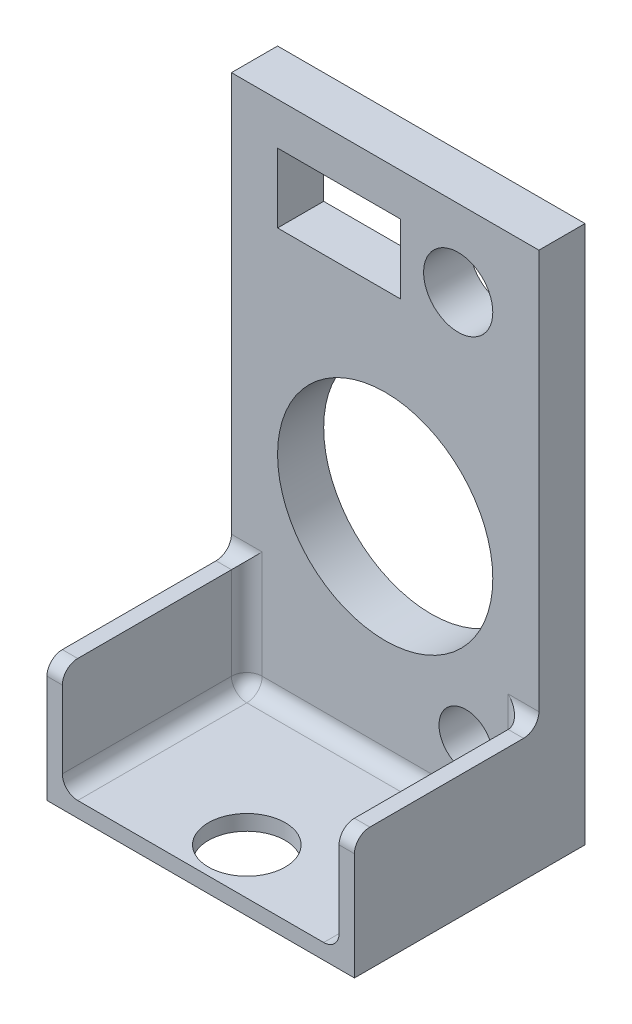
ISO-10303-21;
HEADER;
FILE_DESCRIPTION(('STEP AP214'),'2;1');
FILE_NAME('part.step','',(''),(''),'','','');
FILE_SCHEMA(('AUTOMOTIVE_DESIGN { 1 0 10303 214 1 1 1 1 }'));
ENDSEC;
DATA;
#1=APPLICATION_CONTEXT('core data for automotive mechanical design processes');
#2=APPLICATION_PROTOCOL_DEFINITION('international standard','automotive_design',2000,#1);
#3=PRODUCT_CONTEXT('',#1,'mechanical');
#4=PRODUCT('Part','Part','',(#3));
#5=PRODUCT_RELATED_PRODUCT_CATEGORY('part','',(#4));
#6=PRODUCT_DEFINITION_FORMATION('','',#4);
#7=PRODUCT_DEFINITION_CONTEXT('part definition',#1,'design');
#8=PRODUCT_DEFINITION('design','',#6,#7);
#9=PRODUCT_DEFINITION_SHAPE('','',#8);
#10=(LENGTH_UNIT() NAMED_UNIT(*) SI_UNIT(.MILLI.,.METRE.));
#11=(NAMED_UNIT(*) PLANE_ANGLE_UNIT() SI_UNIT($,.RADIAN.));
#12=(NAMED_UNIT(*) SI_UNIT($,.STERADIAN.) SOLID_ANGLE_UNIT());
#13=UNCERTAINTY_MEASURE_WITH_UNIT(LENGTH_MEASURE(1.E-05),#10,'distance_accuracy_value','');
#14=(GEOMETRIC_REPRESENTATION_CONTEXT(3) GLOBAL_UNCERTAINTY_ASSIGNED_CONTEXT((#13)) GLOBAL_UNIT_ASSIGNED_CONTEXT((#10,
#11,#12)) REPRESENTATION_CONTEXT('',''));
#15=CARTESIAN_POINT('',(0.,0.,0.));
#16=DIRECTION('',(0.,0.,1.));
#17=DIRECTION('',(1.,0.,0.));
#18=AXIS2_PLACEMENT_3D('',#15,#16,#17);
#19=CARTESIAN_POINT('',(0.,0.,0.));
#20=DIRECTION('',(0.,0.,1.));
#21=DIRECTION('',(1.,0.,0.));
#22=AXIS2_PLACEMENT_3D('',#19,#20,#21);
#23=PLANE('',#22);
#24=DIRECTION('',(1.,0.,0.));
#25=VECTOR('',#24,1.);
#26=CARTESIAN_POINT('',(0.,52.25,0.));
#27=LINE('',#26,#25);
#28=CARTESIAN_POINT('',(3.,52.25,0.));
#29=VERTEX_POINT('',#28);
#30=CARTESIAN_POINT('',(11.,52.25,0.));
#31=VERTEX_POINT('',#30);
#32=EDGE_CURVE('E273',#29,#31,#27,.T.);
#33=ORIENTED_EDGE('',*,*,#32,.T.);
#34=DIRECTION('',(0.,-1.,0.));
#35=VECTOR('',#34,1.);
#36=CARTESIAN_POINT('',(11.,0.,0.));
#37=LINE('',#36,#35);
#38=CARTESIAN_POINT('',(11.,47.75,0.));
#39=VERTEX_POINT('',#38);
#40=EDGE_CURVE('E276',#31,#39,#37,.T.);
#41=ORIENTED_EDGE('',*,*,#40,.T.);
#42=DIRECTION('',(1.,0.,0.));
#43=VECTOR('',#42,1.);
#44=CARTESIAN_POINT('',(0.,47.75,0.));
#45=LINE('',#44,#43);
#46=CARTESIAN_POINT('',(3.,47.75,0.));
#47=VERTEX_POINT('',#46);
#48=EDGE_CURVE('E279',#47,#39,#45,.T.);
#49=ORIENTED_EDGE('',*,*,#48,.F.);
#50=DIRECTION('',(0.,-1.,0.));
#51=VECTOR('',#50,1.);
#52=CARTESIAN_POINT('',(3.,0.,0.));
#53=LINE('',#52,#51);
#54=EDGE_CURVE('E223',#29,#47,#53,.T.);
#55=ORIENTED_EDGE('',*,*,#54,.F.);
#56=EDGE_LOOP('',(#33,#41,#49,#55));
#57=FACE_BOUND('',#56,.T.);
#58=CARTESIAN_POINT('',(15.25,25.,0.));
#59=DIRECTION('',(0.,0.,1.));
#60=DIRECTION('',(1.,0.,0.));
#61=AXIS2_PLACEMENT_3D('',#58,#59,#60);
#62=CIRCLE('',#61,1.75);
#63=CARTESIAN_POINT('',(17.,25.,0.));
#64=VERTEX_POINT('',#63);
#65=EDGE_CURVE('E270',#64,#64,#62,.T.);
#66=ORIENTED_EDGE('',*,*,#65,.F.);
#67=EDGE_LOOP('',(#66));
#68=FACE_BOUND('',#67,.T.);
#69=CARTESIAN_POINT('',(14.75,50.,0.));
#70=DIRECTION('',(0.,0.,1.));
#71=DIRECTION('',(1.,0.,0.));
#72=AXIS2_PLACEMENT_3D('',#69,#70,#71);
#73=CIRCLE('',#72,2.25);
#74=CARTESIAN_POINT('',(17.,50.,0.));
#75=VERTEX_POINT('',#74);
#76=EDGE_CURVE('E267',#75,#75,#73,.T.);
#77=ORIENTED_EDGE('',*,*,#76,.F.);
#78=EDGE_LOOP('',(#77));
#79=FACE_BOUND('',#78,.T.);
#80=CARTESIAN_POINT('',(9.99999999999999,35.,0.));
#81=DIRECTION('',(0.,0.,1.));
#82=DIRECTION('',(1.,0.,0.));
#83=AXIS2_PLACEMENT_3D('',#80,#81,#82);
#84=CIRCLE('',#83,7.00000000000001);
#85=CARTESIAN_POINT('',(17.,35.,0.));
#86=VERTEX_POINT('',#85);
#87=EDGE_CURVE('E260',#86,#86,#84,.T.);
#88=ORIENTED_EDGE('',*,*,#87,.F.);
#89=EDGE_LOOP('',(#88));
#90=FACE_BOUND('',#89,.T.);
#91=DIRECTION('',(0.,-1.,0.));
#92=VECTOR('',#91,1.);
#93=CARTESIAN_POINT('',(18.,0.,0.));
#94=LINE('',#93,#92);
#95=CARTESIAN_POINT('',(18.,22.,0.));
#96=VERTEX_POINT('',#95);
#97=CARTESIAN_POINT('',(18.,29.,0.));
#98=VERTEX_POINT('',#97);
#99=EDGE_CURVE('E310',#96,#98,#94,.F.);
#100=ORIENTED_EDGE('',*,*,#99,.T.);
#101=DIRECTION('',(1.,0.,0.));
#102=VECTOR('',#101,1.);
#103=CARTESIAN_POINT('',(20.,29.,0.));
#104=LINE('',#103,#102);
#105=CARTESIAN_POINT('',(20.,29.,0.));
#106=VERTEX_POINT('',#105);
#107=EDGE_CURVE('E308',#98,#106,#104,.T.);
#108=ORIENTED_EDGE('',*,*,#107,.T.);
#109=DIRECTION('',(0.,-1.,0.));
#110=VECTOR('',#109,1.);
#111=CARTESIAN_POINT('',(20.,0.,0.));
#112=LINE('',#111,#110);
#113=CARTESIAN_POINT('',(20.,55.,0.));
#114=VERTEX_POINT('',#113);
#115=EDGE_CURVE('E219',#114,#106,#112,.T.);
#116=ORIENTED_EDGE('',*,*,#115,.F.);
#117=DIRECTION('',(1.,0.,0.));
#118=VECTOR('',#117,1.);
#119=CARTESIAN_POINT('',(0.,55.,0.));
#120=LINE('',#119,#118);
#121=CARTESIAN_POINT('',(0.,55.,0.));
#122=VERTEX_POINT('',#121);
#123=EDGE_CURVE('E250',#122,#114,#120,.T.);
#124=ORIENTED_EDGE('',*,*,#123,.F.);
#125=DIRECTION('',(0.,-1.,0.));
#126=VECTOR('',#125,1.);
#127=CARTESIAN_POINT('',(0.,0.,0.));
#128=LINE('',#127,#126);
#129=CARTESIAN_POINT('',(0.,29.,0.));
#130=VERTEX_POINT('',#129);
#131=EDGE_CURVE('E257',#122,#130,#128,.T.);
#132=ORIENTED_EDGE('',*,*,#131,.T.);
#133=DIRECTION('',(1.,0.,0.));
#134=VECTOR('',#133,1.);
#135=CARTESIAN_POINT('',(1.,29.,0.));
#136=LINE('',#135,#134);
#137=CARTESIAN_POINT('',(2.,29.,0.));
#138=VERTEX_POINT('',#137);
#139=EDGE_CURVE('E315',#130,#138,#136,.T.);
#140=ORIENTED_EDGE('',*,*,#139,.T.);
#141=DIRECTION('',(0.,-1.,0.));
#142=VECTOR('',#141,1.);
#143=CARTESIAN_POINT('',(2.,21.,0.));
#144=LINE('',#143,#142);
#145=CARTESIAN_POINT('',(2.,22.,0.));
#146=VERTEX_POINT('',#145);
#147=EDGE_CURVE('E320',#138,#146,#144,.T.);
#148=ORIENTED_EDGE('',*,*,#147,.T.);
#149=DIRECTION('',(1.,0.,0.));
#150=VECTOR('',#149,1.);
#151=CARTESIAN_POINT('',(19.,22.,0.));
#152=LINE('',#151,#150);
#153=EDGE_CURVE('E286',#146,#96,#152,.T.);
#154=ORIENTED_EDGE('',*,*,#153,.T.);
#155=EDGE_LOOP('',(#100,#108,#116,#124,#132,#140,#148,#154));
#156=FACE_BOUND('',#155,.T.);
#157=ADVANCED_FACE('F35',(#57,#68,#79,#90,#156),#23,.T.);
#158=CARTESIAN_POINT('',(0.,52.25,-3.));
#159=DIRECTION('',(0.,-1.,0.));
#160=DIRECTION('',(0.,0.,-1.));
#161=AXIS2_PLACEMENT_3D('',#158,#159,#160);
#162=PLANE('',#161);
#163=ORIENTED_EDGE('',*,*,#32,.F.);
#164=DIRECTION('',(0.,0.,1.));
#165=VECTOR('',#164,1.);
#166=CARTESIAN_POINT('',(3.,52.25,-3.));
#167=LINE('',#166,#165);
#168=CARTESIAN_POINT('',(3.,52.25,-3.));
#169=VERTEX_POINT('',#168);
#170=EDGE_CURVE('E284',#169,#29,#167,.T.);
#171=ORIENTED_EDGE('',*,*,#170,.F.);
#172=DIRECTION('',(1.,0.,0.));
#173=VECTOR('',#172,1.);
#174=CARTESIAN_POINT('',(0.,52.25,-3.));
#175=LINE('',#174,#173);
#176=CARTESIAN_POINT('',(11.,52.25,-3.));
#177=VERTEX_POINT('',#176);
#178=EDGE_CURVE('E237',#169,#177,#175,.T.);
#179=ORIENTED_EDGE('',*,*,#178,.T.);
#180=DIRECTION('',(0.,0.,1.));
#181=VECTOR('',#180,1.);
#182=CARTESIAN_POINT('',(11.,52.25,-3.));
#183=LINE('',#182,#181);
#184=EDGE_CURVE('E199',#177,#31,#183,.T.);
#185=ORIENTED_EDGE('',*,*,#184,.T.);
#186=EDGE_LOOP('',(#163,#171,#179,#185));
#187=FACE_BOUND('',#186,.T.);
#188=ADVANCED_FACE('F456',(#187),#162,.T.);
#189=CARTESIAN_POINT('',(3.,0.,-3.));
#190=DIRECTION('',(-1.,0.,0.));
#191=DIRECTION('',(0.,-1.,0.));
#192=AXIS2_PLACEMENT_3D('',#189,#190,#191);
#193=PLANE('',#192);
#194=ORIENTED_EDGE('',*,*,#54,.T.);
#195=DIRECTION('',(0.,0.,1.));
#196=VECTOR('',#195,1.);
#197=CARTESIAN_POINT('',(3.,47.75,-3.));
#198=LINE('',#197,#196);
#199=CARTESIAN_POINT('',(3.,47.75,-3.));
#200=VERTEX_POINT('',#199);
#201=EDGE_CURVE('E287',#200,#47,#198,.T.);
#202=ORIENTED_EDGE('',*,*,#201,.F.);
#203=DIRECTION('',(0.,-1.,0.));
#204=VECTOR('',#203,1.);
#205=CARTESIAN_POINT('',(3.,0.,-3.));
#206=LINE('',#205,#204);
#207=EDGE_CURVE('E245',#169,#200,#206,.T.);
#208=ORIENTED_EDGE('',*,*,#207,.F.);
#209=ORIENTED_EDGE('',*,*,#170,.T.);
#210=EDGE_LOOP('',(#194,#202,#208,#209));
#211=FACE_BOUND('',#210,.T.);
#212=ADVANCED_FACE('F462',(#211),#193,.F.);
#213=CARTESIAN_POINT('',(0.,47.75,-3.));
#214=DIRECTION('',(0.,-1.,0.));
#215=DIRECTION('',(0.,0.,-1.));
#216=AXIS2_PLACEMENT_3D('',#213,#214,#215);
#217=PLANE('',#216);
#218=ORIENTED_EDGE('',*,*,#48,.T.);
#219=DIRECTION('',(0.,0.,1.));
#220=VECTOR('',#219,1.);
#221=CARTESIAN_POINT('',(11.,47.75,-3.));
#222=LINE('',#221,#220);
#223=CARTESIAN_POINT('',(11.,47.75,-3.));
#224=VERTEX_POINT('',#223);
#225=EDGE_CURVE('E290',#224,#39,#222,.T.);
#226=ORIENTED_EDGE('',*,*,#225,.F.);
#227=DIRECTION('',(1.,0.,0.));
#228=VECTOR('',#227,1.);
#229=CARTESIAN_POINT('',(0.,47.75,-3.));
#230=LINE('',#229,#228);
#231=EDGE_CURVE('E243',#200,#224,#230,.T.);
#232=ORIENTED_EDGE('',*,*,#231,.F.);
#233=ORIENTED_EDGE('',*,*,#201,.T.);
#234=EDGE_LOOP('',(#218,#226,#232,#233));
#235=FACE_BOUND('',#234,.T.);
#236=ADVANCED_FACE('F472',(#235),#217,.F.);
#237=CARTESIAN_POINT('',(0.,20.,-3.));
#238=DIRECTION('',(0.,-1.,0.));
#239=DIRECTION('',(1.,0.,0.));
#240=AXIS2_PLACEMENT_3D('',#237,#238,#239);
#241=PLANE('',#240);
#242=CARTESIAN_POINT('',(10.,20.,9.));
#243=DIRECTION('',(0.,-1.,0.));
#244=DIRECTION('',(1.,0.,0.));
#245=AXIS2_PLACEMENT_3D('',#242,#243,#244);
#246=CIRCLE('',#245,2.5);
#247=CARTESIAN_POINT('',(12.5,20.,9.));
#248=VERTEX_POINT('',#247);
#249=EDGE_CURVE('E337',#248,#248,#246,.T.);
#250=ORIENTED_EDGE('',*,*,#249,.F.);
#251=EDGE_LOOP('',(#250));
#252=FACE_BOUND('',#251,.T.);
#253=DIRECTION('',(0.,0.,1.));
#254=VECTOR('',#253,1.);
#255=CARTESIAN_POINT('',(20.,20.,-3.));
#256=LINE('',#255,#254);
#257=CARTESIAN_POINT('',(20.,20.,-3.));
#258=VERTEX_POINT('',#257);
#259=CARTESIAN_POINT('',(20.,20.,12.));
#260=VERTEX_POINT('',#259);
#261=EDGE_CURVE('E205',#258,#260,#256,.T.);
#262=ORIENTED_EDGE('',*,*,#261,.T.);
#263=DIRECTION('',(1.,0.,0.));
#264=VECTOR('',#263,1.);
#265=CARTESIAN_POINT('',(0.,20.,12.));
#266=LINE('',#265,#264);
#267=CARTESIAN_POINT('',(0.,20.,12.));
#268=VERTEX_POINT('',#267);
#269=EDGE_CURVE('E183',#268,#260,#266,.T.);
#270=ORIENTED_EDGE('',*,*,#269,.F.);
#271=DIRECTION('',(0.,0.,1.));
#272=VECTOR('',#271,1.);
#273=CARTESIAN_POINT('',(0.,20.,-3.));
#274=LINE('',#273,#272);
#275=CARTESIAN_POINT('',(0.,20.,-3.));
#276=VERTEX_POINT('',#275);
#277=EDGE_CURVE('E192',#276,#268,#274,.T.);
#278=ORIENTED_EDGE('',*,*,#277,.F.);
#279=DIRECTION('',(1.,0.,0.));
#280=VECTOR('',#279,1.);
#281=CARTESIAN_POINT('',(0.,20.,-3.));
#282=LINE('',#281,#280);
#283=EDGE_CURVE('E220',#276,#258,#282,.T.);
#284=ORIENTED_EDGE('',*,*,#283,.T.);
#285=EDGE_LOOP('',(#262,#270,#278,#284));
#286=FACE_BOUND('',#285,.T.);
#287=ADVANCED_FACE('F203',(#252,#286),#241,.T.);
#288=CARTESIAN_POINT('',(0.,0.,-3.));
#289=DIRECTION('',(-1.,0.,0.));
#290=DIRECTION('',(0.,-1.,0.));
#291=AXIS2_PLACEMENT_3D('',#288,#289,#290);
#292=PLANE('',#291);
#293=DIRECTION('',(0.,-1.,0.));
#294=VECTOR('',#293,1.);
#295=CARTESIAN_POINT('',(0.,0.,12.));
#296=LINE('',#295,#294);
#297=CARTESIAN_POINT('',(0.,27.,12.));
#298=VERTEX_POINT('',#297);
#299=EDGE_CURVE('E178',#298,#268,#296,.T.);
#300=ORIENTED_EDGE('',*,*,#299,.F.);
#301=CARTESIAN_POINT('',(0.,27.,11.));
#302=DIRECTION('',(-1.,0.,0.));
#303=DIRECTION('',(0.,-1.,0.));
#304=AXIS2_PLACEMENT_3D('',#301,#302,#303);
#305=CIRCLE('',#304,1.);
#306=CARTESIAN_POINT('',(0.,28.,11.));
#307=VERTEX_POINT('',#306);
#308=EDGE_CURVE('E410',#298,#307,#305,.T.);
#309=ORIENTED_EDGE('',*,*,#308,.T.);
#310=DIRECTION('',(0.,0.,-1.));
#311=VECTOR('',#310,1.);
#312=CARTESIAN_POINT('',(0.,28.,12.));
#313=LINE('',#312,#311);
#314=CARTESIAN_POINT('',(0.,28.,1.));
#315=VERTEX_POINT('',#314);
#316=EDGE_CURVE('E216',#307,#315,#313,.T.);
#317=ORIENTED_EDGE('',*,*,#316,.T.);
#318=CARTESIAN_POINT('',(0.,29.,1.));
#319=DIRECTION('',(-1.,0.,0.));
#320=DIRECTION('',(0.,-1.,0.));
#321=AXIS2_PLACEMENT_3D('',#318,#319,#320);
#322=CIRCLE('',#321,1.);
#323=EDGE_CURVE('E418',#315,#130,#322,.F.);
#324=ORIENTED_EDGE('',*,*,#323,.T.);
#325=ORIENTED_EDGE('',*,*,#131,.F.);
#326=DIRECTION('',(0.,0.,1.));
#327=VECTOR('',#326,1.);
#328=CARTESIAN_POINT('',(0.,55.,-3.));
#329=LINE('',#328,#327);
#330=CARTESIAN_POINT('',(0.,55.,-3.));
#331=VERTEX_POINT('',#330);
#332=EDGE_CURVE('E200',#331,#122,#329,.T.);
#333=ORIENTED_EDGE('',*,*,#332,.F.);
#334=DIRECTION('',(0.,-1.,0.));
#335=VECTOR('',#334,1.);
#336=CARTESIAN_POINT('',(0.,0.,-3.));
#337=LINE('',#336,#335);
#338=EDGE_CURVE('E195',#331,#276,#337,.T.);
#339=ORIENTED_EDGE('',*,*,#338,.T.);
#340=ORIENTED_EDGE('',*,*,#277,.T.);
#341=EDGE_LOOP('',(#300,#309,#317,#324,#325,#333,#339,#340));
#342=FACE_BOUND('',#341,.T.);
#343=ADVANCED_FACE('F193',(#342),#292,.T.);
#344=CARTESIAN_POINT('',(0.,55.,-3.));
#345=DIRECTION('',(0.,-1.,0.));
#346=DIRECTION('',(0.,0.,-1.));
#347=AXIS2_PLACEMENT_3D('',#344,#345,#346);
#348=PLANE('',#347);
#349=ORIENTED_EDGE('',*,*,#123,.T.);
#350=DIRECTION('',(0.,0.,1.));
#351=VECTOR('',#350,1.);
#352=CARTESIAN_POINT('',(20.,55.,-3.));
#353=LINE('',#352,#351);
#354=CARTESIAN_POINT('',(20.,55.,-3.));
#355=VERTEX_POINT('',#354);
#356=EDGE_CURVE('E293',#355,#114,#353,.T.);
#357=ORIENTED_EDGE('',*,*,#356,.F.);
#358=DIRECTION('',(1.,0.,0.));
#359=VECTOR('',#358,1.);
#360=CARTESIAN_POINT('',(0.,55.,-3.));
#361=LINE('',#360,#359);
#362=EDGE_CURVE('E225',#331,#355,#361,.T.);
#363=ORIENTED_EDGE('',*,*,#362,.F.);
#364=ORIENTED_EDGE('',*,*,#332,.T.);
#365=EDGE_LOOP('',(#349,#357,#363,#364));
#366=FACE_BOUND('',#365,.T.);
#367=ADVANCED_FACE('F485',(#366),#348,.F.);
#368=CARTESIAN_POINT('',(15.25,25.,-3.));
#369=DIRECTION('',(0.,0.,1.));
#370=DIRECTION('',(1.,0.,0.));
#371=AXIS2_PLACEMENT_3D('',#368,#369,#370);
#372=CYLINDRICAL_SURFACE('',#371,1.75);
#373=CARTESIAN_POINT('',(15.25,25.,-3.));
#374=DIRECTION('',(0.,0.,1.));
#375=DIRECTION('',(1.,0.,0.));
#376=AXIS2_PLACEMENT_3D('',#373,#374,#375);
#377=CIRCLE('',#376,1.75);
#378=CARTESIAN_POINT('',(17.,25.,-3.));
#379=VERTEX_POINT('',#378);
#380=EDGE_CURVE('E234',#379,#379,#377,.T.);
#381=ORIENTED_EDGE('',*,*,#380,.F.);
#382=EDGE_LOOP('',(#381));
#383=FACE_BOUND('',#382,.T.);
#384=ORIENTED_EDGE('',*,*,#65,.T.);
#385=EDGE_LOOP('',(#384));
#386=FACE_BOUND('',#385,.T.);
#387=ADVANCED_FACE('F481',(#383,#386),#372,.F.);
#388=CARTESIAN_POINT('',(14.75,50.,-3.));
#389=DIRECTION('',(0.,0.,1.));
#390=DIRECTION('',(1.,0.,0.));
#391=AXIS2_PLACEMENT_3D('',#388,#389,#390);
#392=CYLINDRICAL_SURFACE('',#391,2.25);
#393=CARTESIAN_POINT('',(14.75,50.,-3.));
#394=DIRECTION('',(0.,0.,1.));
#395=DIRECTION('',(1.,0.,0.));
#396=AXIS2_PLACEMENT_3D('',#393,#394,#395);
#397=CIRCLE('',#396,2.25);
#398=CARTESIAN_POINT('',(17.,50.,-3.));
#399=VERTEX_POINT('',#398);
#400=EDGE_CURVE('E231',#399,#399,#397,.T.);
#401=ORIENTED_EDGE('',*,*,#400,.F.);
#402=EDGE_LOOP('',(#401));
#403=FACE_BOUND('',#402,.T.);
#404=ORIENTED_EDGE('',*,*,#76,.T.);
#405=EDGE_LOOP('',(#404));
#406=FACE_BOUND('',#405,.T.);
#407=ADVANCED_FACE('F484',(#403,#406),#392,.F.);
#408=CARTESIAN_POINT('',(9.99999999999999,35.,-3.));
#409=DIRECTION('',(0.,0.,1.));
#410=DIRECTION('',(1.,0.,0.));
#411=AXIS2_PLACEMENT_3D('',#408,#409,#410);
#412=CYLINDRICAL_SURFACE('',#411,7.00000000000001);
#413=CARTESIAN_POINT('',(9.99999999999999,35.,-3.));
#414=DIRECTION('',(0.,0.,1.));
#415=DIRECTION('',(1.,0.,0.));
#416=AXIS2_PLACEMENT_3D('',#413,#414,#415);
#417=CIRCLE('',#416,7.00000000000001);
#418=CARTESIAN_POINT('',(17.,35.,-3.));
#419=VERTEX_POINT('',#418);
#420=EDGE_CURVE('E228',#419,#419,#417,.T.);
#421=ORIENTED_EDGE('',*,*,#420,.F.);
#422=EDGE_LOOP('',(#421));
#423=FACE_BOUND('',#422,.T.);
#424=ORIENTED_EDGE('',*,*,#87,.T.);
#425=EDGE_LOOP('',(#424));
#426=FACE_BOUND('',#425,.T.);
#427=ADVANCED_FACE('F489',(#423,#426),#412,.F.);
#428=CARTESIAN_POINT('',(20.,0.,-3.));
#429=DIRECTION('',(-1.,0.,0.));
#430=DIRECTION('',(0.,-1.,0.));
#431=AXIS2_PLACEMENT_3D('',#428,#429,#430);
#432=PLANE('',#431);
#433=DIRECTION('',(0.,0.,-1.));
#434=VECTOR('',#433,1.);
#435=CARTESIAN_POINT('',(20.,28.,12.));
#436=LINE('',#435,#434);
#437=CARTESIAN_POINT('',(20.,28.,11.));
#438=VERTEX_POINT('',#437);
#439=CARTESIAN_POINT('',(20.,28.,1.));
#440=VERTEX_POINT('',#439);
#441=EDGE_CURVE('E208',#438,#440,#436,.T.);
#442=ORIENTED_EDGE('',*,*,#441,.F.);
#443=CARTESIAN_POINT('',(20.,27.,11.));
#444=DIRECTION('',(-1.,0.,0.));
#445=DIRECTION('',(0.,-1.,0.));
#446=AXIS2_PLACEMENT_3D('',#443,#444,#445);
#447=CIRCLE('',#446,1.);
#448=CARTESIAN_POINT('',(20.,27.,12.));
#449=VERTEX_POINT('',#448);
#450=EDGE_CURVE('E433',#438,#449,#447,.F.);
#451=ORIENTED_EDGE('',*,*,#450,.T.);
#452=DIRECTION('',(0.,-1.,0.));
#453=VECTOR('',#452,1.);
#454=CARTESIAN_POINT('',(20.,0.,12.));
#455=LINE('',#454,#453);
#456=EDGE_CURVE('E206',#449,#260,#455,.T.);
#457=ORIENTED_EDGE('',*,*,#456,.T.);
#458=ORIENTED_EDGE('',*,*,#261,.F.);
#459=DIRECTION('',(0.,-1.,0.));
#460=VECTOR('',#459,1.);
#461=CARTESIAN_POINT('',(20.,0.,-3.));
#462=LINE('',#461,#460);
#463=EDGE_CURVE('E222',#355,#258,#462,.T.);
#464=ORIENTED_EDGE('',*,*,#463,.F.);
#465=ORIENTED_EDGE('',*,*,#356,.T.);
#466=ORIENTED_EDGE('',*,*,#115,.T.);
#467=CARTESIAN_POINT('',(20.,29.,1.));
#468=DIRECTION('',(-1.,0.,0.));
#469=DIRECTION('',(0.,-1.,0.));
#470=AXIS2_PLACEMENT_3D('',#467,#468,#469);
#471=CIRCLE('',#470,1.);
#472=EDGE_CURVE('E416',#106,#440,#471,.T.);
#473=ORIENTED_EDGE('',*,*,#472,.T.);
#474=EDGE_LOOP('',(#442,#451,#457,#458,#464,#465,#466,#473));
#475=FACE_BOUND('',#474,.T.);
#476=ADVANCED_FACE('F300',(#475),#432,.F.);
#477=CARTESIAN_POINT('',(11.,0.,-3.));
#478=DIRECTION('',(-1.,0.,0.));
#479=DIRECTION('',(0.,-1.,0.));
#480=AXIS2_PLACEMENT_3D('',#477,#478,#479);
#481=PLANE('',#480);
#482=ORIENTED_EDGE('',*,*,#40,.F.);
#483=ORIENTED_EDGE('',*,*,#184,.F.);
#484=DIRECTION('',(0.,-1.,0.));
#485=VECTOR('',#484,1.);
#486=CARTESIAN_POINT('',(11.,0.,-3.));
#487=LINE('',#486,#485);
#488=EDGE_CURVE('E240',#177,#224,#487,.T.);
#489=ORIENTED_EDGE('',*,*,#488,.T.);
#490=ORIENTED_EDGE('',*,*,#225,.T.);
#491=EDGE_LOOP('',(#482,#483,#489,#490));
#492=FACE_BOUND('',#491,.T.);
#493=ADVANCED_FACE('F477',(#492),#481,.T.);
#494=CARTESIAN_POINT('',(0.,0.,-3.));
#495=DIRECTION('',(0.,0.,1.));
#496=DIRECTION('',(1.,0.,0.));
#497=AXIS2_PLACEMENT_3D('',#494,#495,#496);
#498=PLANE('',#497);
#499=ORIENTED_EDGE('',*,*,#283,.F.);
#500=ORIENTED_EDGE('',*,*,#338,.F.);
#501=ORIENTED_EDGE('',*,*,#362,.T.);
#502=ORIENTED_EDGE('',*,*,#463,.T.);
#503=EDGE_LOOP('',(#499,#500,#501,#502));
#504=FACE_BOUND('',#503,.T.);
#505=ORIENTED_EDGE('',*,*,#420,.T.);
#506=EDGE_LOOP('',(#505));
#507=FACE_BOUND('',#506,.T.);
#508=ORIENTED_EDGE('',*,*,#400,.T.);
#509=EDGE_LOOP('',(#508));
#510=FACE_BOUND('',#509,.T.);
#511=ORIENTED_EDGE('',*,*,#380,.T.);
#512=EDGE_LOOP('',(#511));
#513=FACE_BOUND('',#512,.T.);
#514=ORIENTED_EDGE('',*,*,#178,.F.);
#515=ORIENTED_EDGE('',*,*,#207,.T.);
#516=ORIENTED_EDGE('',*,*,#231,.T.);
#517=ORIENTED_EDGE('',*,*,#488,.F.);
#518=EDGE_LOOP('',(#514,#515,#516,#517));
#519=FACE_BOUND('',#518,.T.);
#520=ADVANCED_FACE('F468',(#504,#507,#510,#513,#519),#498,.F.);
#521=CARTESIAN_POINT('',(0.,27.9999999999999,12.));
#522=DIRECTION('',(0.,1.,0.));
#523=DIRECTION('',(-1.,0.,0.));
#524=AXIS2_PLACEMENT_3D('',#521,#522,#523);
#525=PLANE('',#524);
#526=ORIENTED_EDGE('',*,*,#441,.T.);
#527=DIRECTION('',(1.,0.,0.));
#528=VECTOR('',#527,1.);
#529=CARTESIAN_POINT('',(19.,28.,1.));
#530=LINE('',#529,#528);
#531=CARTESIAN_POINT('',(19.,28.,1.));
#532=VERTEX_POINT('',#531);
#533=EDGE_CURVE('E318',#440,#532,#530,.F.);
#534=ORIENTED_EDGE('',*,*,#533,.T.);
#535=DIRECTION('',(0.,0.,-1.));
#536=VECTOR('',#535,1.);
#537=CARTESIAN_POINT('',(19.,28.,12.));
#538=LINE('',#537,#536);
#539=CARTESIAN_POINT('',(19.,28.,11.));
#540=VERTEX_POINT('',#539);
#541=EDGE_CURVE('E215',#540,#532,#538,.T.);
#542=ORIENTED_EDGE('',*,*,#541,.F.);
#543=DIRECTION('',(1.,0.,0.));
#544=VECTOR('',#543,1.);
#545=CARTESIAN_POINT('',(0.,27.9999999999999,11.));
#546=LINE('',#545,#544);
#547=EDGE_CURVE('E314',#540,#438,#546,.T.);
#548=ORIENTED_EDGE('',*,*,#547,.T.);
#549=EDGE_LOOP('',(#526,#534,#542,#548));
#550=FACE_BOUND('',#549,.T.);
#551=ADVANCED_FACE('F635',(#550),#525,.T.);
#552=CARTESIAN_POINT('',(19.,0.,12.));
#553=DIRECTION('',(1.,0.,0.));
#554=DIRECTION('',(0.,0.,-1.));
#555=AXIS2_PLACEMENT_3D('',#552,#553,#554);
#556=PLANE('',#555);
#557=DIRECTION('',(0.,-1.,0.));
#558=VECTOR('',#557,1.);
#559=CARTESIAN_POINT('',(19.,0.,12.));
#560=LINE('',#559,#558);
#561=CARTESIAN_POINT('',(19.,27.,12.));
#562=VERTEX_POINT('',#561);
#563=CARTESIAN_POINT('',(19.,22.,12.));
#564=VERTEX_POINT('',#563);
#565=EDGE_CURVE('E336',#562,#564,#560,.T.);
#566=ORIENTED_EDGE('',*,*,#565,.F.);
#567=CARTESIAN_POINT('',(19.,27.,11.));
#568=DIRECTION('',(1.,0.,0.));
#569=DIRECTION('',(0.,0.,-1.));
#570=AXIS2_PLACEMENT_3D('',#567,#568,#569);
#571=CIRCLE('',#570,1.);
#572=EDGE_CURVE('E403',#562,#540,#571,.F.);
#573=ORIENTED_EDGE('',*,*,#572,.T.);
#574=ORIENTED_EDGE('',*,*,#541,.T.);
#575=DIRECTION('',(0.,-1.,0.));
#576=VECTOR('',#575,1.);
#577=CARTESIAN_POINT('',(19.,0.,1.));
#578=LINE('',#577,#576);
#579=CARTESIAN_POINT('',(19.,22.,1.));
#580=VERTEX_POINT('',#579);
#581=EDGE_CURVE('E380',#532,#580,#578,.T.);
#582=ORIENTED_EDGE('',*,*,#581,.T.);
#583=DIRECTION('',(0.,0.,-1.));
#584=VECTOR('',#583,1.);
#585=CARTESIAN_POINT('',(19.,22.,12.));
#586=LINE('',#585,#584);
#587=EDGE_CURVE('E426',#580,#564,#586,.F.);
#588=ORIENTED_EDGE('',*,*,#587,.T.);
#589=EDGE_LOOP('',(#566,#573,#574,#582,#588));
#590=FACE_BOUND('',#589,.T.);
#591=ADVANCED_FACE('F625',(#590),#556,.F.);
#592=CARTESIAN_POINT('',(0.,21.,12.));
#593=DIRECTION('',(0.,1.,0.));
#594=DIRECTION('',(0.,0.,1.));
#595=AXIS2_PLACEMENT_3D('',#592,#593,#594);
#596=PLANE('',#595);
#597=CARTESIAN_POINT('',(9.99999999999999,21.,9.));
#598=DIRECTION('',(0.,1.,0.));
#599=DIRECTION('',(0.,0.,1.));
#600=AXIS2_PLACEMENT_3D('',#597,#598,#599);
#601=CIRCLE('',#600,2.5);
#602=CARTESIAN_POINT('',(9.99999999999999,21.,11.5));
#603=VERTEX_POINT('',#602);
#604=EDGE_CURVE('E333',#603,#603,#601,.T.);
#605=ORIENTED_EDGE('',*,*,#604,.F.);
#606=EDGE_LOOP('',(#605));
#607=FACE_BOUND('',#606,.T.);
#608=DIRECTION('',(1.,0.,0.));
#609=VECTOR('',#608,1.);
#610=CARTESIAN_POINT('',(0.,21.,12.));
#611=LINE('',#610,#609);
#612=CARTESIAN_POINT('',(2.,21.,12.));
#613=VERTEX_POINT('',#612);
#614=CARTESIAN_POINT('',(18.,21.,12.));
#615=VERTEX_POINT('',#614);
#616=EDGE_CURVE('E392',#613,#615,#611,.T.);
#617=ORIENTED_EDGE('',*,*,#616,.T.);
#618=DIRECTION('',(0.,0.,-1.));
#619=VECTOR('',#618,1.);
#620=CARTESIAN_POINT('',(18.,21.,12.));
#621=LINE('',#620,#619);
#622=CARTESIAN_POINT('',(18.,21.,1.));
#623=VERTEX_POINT('',#622);
#624=EDGE_CURVE('E52',#615,#623,#621,.T.);
#625=ORIENTED_EDGE('',*,*,#624,.T.);
#626=DIRECTION('',(1.,0.,0.));
#627=VECTOR('',#626,1.);
#628=CARTESIAN_POINT('',(1.,21.,1.));
#629=LINE('',#628,#627);
#630=CARTESIAN_POINT('',(2.,21.,1.));
#631=VERTEX_POINT('',#630);
#632=EDGE_CURVE('E56',#623,#631,#629,.F.);
#633=ORIENTED_EDGE('',*,*,#632,.T.);
#634=DIRECTION('',(0.,0.,-1.));
#635=VECTOR('',#634,1.);
#636=CARTESIAN_POINT('',(2.,21.,12.));
#637=LINE('',#636,#635);
#638=EDGE_CURVE('E412',#631,#613,#637,.F.);
#639=ORIENTED_EDGE('',*,*,#638,.T.);
#640=EDGE_LOOP('',(#617,#625,#633,#639));
#641=FACE_BOUND('',#640,.T.);
#642=ADVANCED_FACE('F424',(#607,#641),#596,.T.);
#643=CARTESIAN_POINT('',(1.,0.,12.));
#644=DIRECTION('',(1.,0.,0.));
#645=DIRECTION('',(0.,0.,-1.));
#646=AXIS2_PLACEMENT_3D('',#643,#644,#645);
#647=PLANE('',#646);
#648=DIRECTION('',(0.,0.,-1.));
#649=VECTOR('',#648,1.);
#650=CARTESIAN_POINT('',(1.,28.,12.));
#651=LINE('',#650,#649);
#652=CARTESIAN_POINT('',(1.,28.,11.));
#653=VERTEX_POINT('',#652);
#654=CARTESIAN_POINT('',(1.,28.,1.));
#655=VERTEX_POINT('',#654);
#656=EDGE_CURVE('E212',#653,#655,#651,.T.);
#657=ORIENTED_EDGE('',*,*,#656,.F.);
#658=CARTESIAN_POINT('',(1.,27.,11.));
#659=DIRECTION('',(1.,0.,0.));
#660=DIRECTION('',(0.,0.,-1.));
#661=AXIS2_PLACEMENT_3D('',#658,#659,#660);
#662=CIRCLE('',#661,1.);
#663=CARTESIAN_POINT('',(1.,27.,12.));
#664=VERTEX_POINT('',#663);
#665=EDGE_CURVE('E399',#653,#664,#662,.T.);
#666=ORIENTED_EDGE('',*,*,#665,.T.);
#667=DIRECTION('',(0.,-1.,0.));
#668=VECTOR('',#667,1.);
#669=CARTESIAN_POINT('',(1.,0.,12.));
#670=LINE('',#669,#668);
#671=CARTESIAN_POINT('',(1.,22.,12.));
#672=VERTEX_POINT('',#671);
#673=EDGE_CURVE('E189',#664,#672,#670,.T.);
#674=ORIENTED_EDGE('',*,*,#673,.T.);
#675=DIRECTION('',(0.,0.,-1.));
#676=VECTOR('',#675,1.);
#677=CARTESIAN_POINT('',(1.,22.,0.));
#678=LINE('',#677,#676);
#679=CARTESIAN_POINT('',(1.,22.,1.));
#680=VERTEX_POINT('',#679);
#681=EDGE_CURVE('E398',#672,#680,#678,.T.);
#682=ORIENTED_EDGE('',*,*,#681,.T.);
#683=DIRECTION('',(0.,-1.,0.));
#684=VECTOR('',#683,1.);
#685=CARTESIAN_POINT('',(1.,28.,1.));
#686=LINE('',#685,#684);
#687=EDGE_CURVE('E352',#680,#655,#686,.F.);
#688=ORIENTED_EDGE('',*,*,#687,.T.);
#689=EDGE_LOOP('',(#657,#666,#674,#682,#688));
#690=FACE_BOUND('',#689,.T.);
#691=ADVANCED_FACE('F397',(#690),#647,.T.);
#692=CARTESIAN_POINT('',(0.,28.,12.));
#693=DIRECTION('',(0.,1.,0.));
#694=DIRECTION('',(0.,0.,1.));
#695=AXIS2_PLACEMENT_3D('',#692,#693,#694);
#696=PLANE('',#695);
#697=ORIENTED_EDGE('',*,*,#656,.T.);
#698=DIRECTION('',(1.,0.,0.));
#699=VECTOR('',#698,1.);
#700=CARTESIAN_POINT('',(0.,28.,1.));
#701=LINE('',#700,#699);
#702=EDGE_CURVE('E434',#655,#315,#701,.F.);
#703=ORIENTED_EDGE('',*,*,#702,.T.);
#704=ORIENTED_EDGE('',*,*,#316,.F.);
#705=DIRECTION('',(1.,0.,0.));
#706=VECTOR('',#705,1.);
#707=CARTESIAN_POINT('',(0.,28.,11.));
#708=LINE('',#707,#706);
#709=EDGE_CURVE('E327',#307,#653,#708,.T.);
#710=ORIENTED_EDGE('',*,*,#709,.T.);
#711=EDGE_LOOP('',(#697,#703,#704,#710));
#712=FACE_BOUND('',#711,.T.);
#713=ADVANCED_FACE('F440',(#712),#696,.T.);
#714=CARTESIAN_POINT('',(0.,0.,12.));
#715=DIRECTION('',(0.,0.,1.));
#716=DIRECTION('',(1.,0.,0.));
#717=AXIS2_PLACEMENT_3D('',#714,#715,#716);
#718=PLANE('',#717);
#719=ORIENTED_EDGE('',*,*,#456,.F.);
#720=DIRECTION('',(1.,0.,0.));
#721=VECTOR('',#720,1.);
#722=CARTESIAN_POINT('',(0.,26.9999999999999,12.));
#723=LINE('',#722,#721);
#724=EDGE_CURVE('E428',#449,#562,#723,.F.);
#725=ORIENTED_EDGE('',*,*,#724,.T.);
#726=ORIENTED_EDGE('',*,*,#565,.T.);
#727=CARTESIAN_POINT('',(18.,22.,12.));
#728=DIRECTION('',(0.,0.,1.));
#729=DIRECTION('',(1.,0.,0.));
#730=AXIS2_PLACEMENT_3D('',#727,#728,#729);
#731=CIRCLE('',#730,1.);
#732=EDGE_CURVE('E44',#564,#615,#731,.F.);
#733=ORIENTED_EDGE('',*,*,#732,.T.);
#734=ORIENTED_EDGE('',*,*,#616,.F.);
#735=CARTESIAN_POINT('',(2.,22.,12.));
#736=DIRECTION('',(0.,0.,1.));
#737=DIRECTION('',(1.,0.,0.));
#738=AXIS2_PLACEMENT_3D('',#735,#736,#737);
#739=CIRCLE('',#738,1.);
#740=EDGE_CURVE('E11',#613,#672,#739,.F.);
#741=ORIENTED_EDGE('',*,*,#740,.T.);
#742=ORIENTED_EDGE('',*,*,#673,.F.);
#743=DIRECTION('',(1.,0.,0.));
#744=VECTOR('',#743,1.);
#745=CARTESIAN_POINT('',(0.,27.,12.));
#746=LINE('',#745,#744);
#747=EDGE_CURVE('E186',#664,#298,#746,.F.);
#748=ORIENTED_EDGE('',*,*,#747,.T.);
#749=ORIENTED_EDGE('',*,*,#299,.T.);
#750=ORIENTED_EDGE('',*,*,#269,.T.);
#751=EDGE_LOOP('',(#719,#725,#726,#733,#734,#741,#742,#748,#749,#750));
#752=FACE_BOUND('',#751,.T.);
#753=ADVANCED_FACE('F181',(#752),#718,.T.);
#754=CARTESIAN_POINT('',(9.99999999999999,55.000025,9.));
#755=DIRECTION('',(0.,-1.,0.));
#756=DIRECTION('',(1.,0.,0.));
#757=AXIS2_PLACEMENT_3D('',#754,#755,#756);
#758=CYLINDRICAL_SURFACE('',#757,2.5);
#759=ORIENTED_EDGE('',*,*,#604,.T.);
#760=EDGE_LOOP('',(#759));
#761=FACE_BOUND('',#760,.T.);
#762=ORIENTED_EDGE('',*,*,#249,.T.);
#763=EDGE_LOOP('',(#762));
#764=FACE_BOUND('',#763,.T.);
#765=ADVANCED_FACE('F446',(#761,#764),#758,.F.);
#766=CARTESIAN_POINT('',(0.,29.,1.));
#767=DIRECTION('',(-1.,0.,0.));
#768=DIRECTION('',(0.,0.,1.));
#769=AXIS2_PLACEMENT_3D('',#766,#767,#768);
#770=CYLINDRICAL_SURFACE('',#769,1.);
#771=ORIENTED_EDGE('',*,*,#323,.F.);
#772=ORIENTED_EDGE('',*,*,#702,.F.);
#773=CARTESIAN_POINT('',(2.,29.,1.));
#774=DIRECTION('',(-0.707106781186547,0.707106781186547,0.));
#775=DIRECTION('',(0.707106781186547,0.707106781186547,0.));
#776=AXIS2_PLACEMENT_3D('',#773,#774,#775);
#777=ELLIPSE('',#776,1.41421356237309,1.);
#778=EDGE_CURVE('E39',#138,#655,#777,.T.);
#779=ORIENTED_EDGE('',*,*,#778,.F.);
#780=ORIENTED_EDGE('',*,*,#139,.F.);
#781=EDGE_LOOP('',(#771,#772,#779,#780));
#782=FACE_BOUND('',#781,.T.);
#783=ADVANCED_FACE('F444',(#782),#770,.F.);
#784=CARTESIAN_POINT('',(2.,22.,12.));
#785=DIRECTION('',(0.,0.,1.));
#786=DIRECTION('',(1.,0.,0.));
#787=AXIS2_PLACEMENT_3D('',#784,#785,#786);
#788=CYLINDRICAL_SURFACE('',#787,1.);
#789=ORIENTED_EDGE('',*,*,#740,.F.);
#790=ORIENTED_EDGE('',*,*,#638,.F.);
#791=CARTESIAN_POINT('',(2.,22.,1.));
#792=DIRECTION('',(0.,0.,1.));
#793=DIRECTION('',(1.,0.,0.));
#794=AXIS2_PLACEMENT_3D('',#791,#792,#793);
#795=CIRCLE('',#794,1.);
#796=EDGE_CURVE('E356',#680,#631,#795,.T.);
#797=ORIENTED_EDGE('',*,*,#796,.F.);
#798=ORIENTED_EDGE('',*,*,#681,.F.);
#799=EDGE_LOOP('',(#789,#790,#797,#798));
#800=FACE_BOUND('',#799,.T.);
#801=ADVANCED_FACE('F402',(#800),#788,.F.);
#802=CARTESIAN_POINT('',(2.,0.,1.));
#803=DIRECTION('',(0.,1.,0.));
#804=DIRECTION('',(0.,0.,1.));
#805=AXIS2_PLACEMENT_3D('',#802,#803,#804);
#806=CYLINDRICAL_SURFACE('',#805,1.);
#807=ORIENTED_EDGE('',*,*,#778,.T.);
#808=ORIENTED_EDGE('',*,*,#687,.F.);
#809=CARTESIAN_POINT('',(2.,22.,1.));
#810=DIRECTION('',(0.,1.,0.));
#811=DIRECTION('',(0.,0.,1.));
#812=AXIS2_PLACEMENT_3D('',#809,#810,#811);
#813=CIRCLE('',#812,1.);
#814=EDGE_CURVE('E349',#146,#680,#813,.T.);
#815=ORIENTED_EDGE('',*,*,#814,.F.);
#816=ORIENTED_EDGE('',*,*,#147,.F.);
#817=EDGE_LOOP('',(#807,#808,#815,#816));
#818=FACE_BOUND('',#817,.T.);
#819=ADVANCED_FACE('F351',(#818),#806,.F.);
#820=CARTESIAN_POINT('',(2.,22.,1.));
#821=DIRECTION('',(0.,0.,1.));
#822=DIRECTION('',(1.,0.,0.));
#823=AXIS2_PLACEMENT_3D('',#820,#821,#822);
#824=SPHERICAL_SURFACE('',#823,1.);
#825=ORIENTED_EDGE('',*,*,#814,.T.);
#826=ORIENTED_EDGE('',*,*,#796,.T.);
#827=CARTESIAN_POINT('',(2.,22.,1.));
#828=DIRECTION('',(1.,0.,0.));
#829=DIRECTION('',(0.,0.,-1.));
#830=AXIS2_PLACEMENT_3D('',#827,#828,#829);
#831=CIRCLE('',#830,1.);
#832=EDGE_CURVE('E357',#146,#631,#831,.F.);
#833=ORIENTED_EDGE('',*,*,#832,.F.);
#834=EDGE_LOOP('',(#825,#826,#833));
#835=FACE_BOUND('',#834,.T.);
#836=ADVANCED_FACE('F360',(#835),#824,.F.);
#837=CARTESIAN_POINT('',(18.,22.,12.));
#838=DIRECTION('',(0.,0.,-1.));
#839=DIRECTION('',(-1.,0.,0.));
#840=AXIS2_PLACEMENT_3D('',#837,#838,#839);
#841=CYLINDRICAL_SURFACE('',#840,1.);
#842=ORIENTED_EDGE('',*,*,#732,.F.);
#843=ORIENTED_EDGE('',*,*,#587,.F.);
#844=CARTESIAN_POINT('',(18.,22.,1.));
#845=DIRECTION('',(0.,0.,1.));
#846=DIRECTION('',(1.,0.,0.));
#847=AXIS2_PLACEMENT_3D('',#844,#845,#846);
#848=CIRCLE('',#847,1.);
#849=EDGE_CURVE('E362',#623,#580,#848,.T.);
#850=ORIENTED_EDGE('',*,*,#849,.F.);
#851=ORIENTED_EDGE('',*,*,#624,.F.);
#852=EDGE_LOOP('',(#842,#843,#850,#851));
#853=FACE_BOUND('',#852,.T.);
#854=ADVANCED_FACE('F425',(#853),#841,.F.);
#855=CARTESIAN_POINT('',(0.,22.,1.));
#856=DIRECTION('',(-1.,0.,0.));
#857=DIRECTION('',(0.,0.,1.));
#858=AXIS2_PLACEMENT_3D('',#855,#856,#857);
#859=CYLINDRICAL_SURFACE('',#858,1.);
#860=ORIENTED_EDGE('',*,*,#832,.T.);
#861=ORIENTED_EDGE('',*,*,#632,.F.);
#862=CARTESIAN_POINT('',(18.,22.,1.));
#863=DIRECTION('',(-1.,0.,0.));
#864=DIRECTION('',(0.,0.,1.));
#865=AXIS2_PLACEMENT_3D('',#862,#863,#864);
#866=CIRCLE('',#865,1.);
#867=EDGE_CURVE('E366',#96,#623,#866,.T.);
#868=ORIENTED_EDGE('',*,*,#867,.F.);
#869=ORIENTED_EDGE('',*,*,#153,.F.);
#870=EDGE_LOOP('',(#860,#861,#868,#869));
#871=FACE_BOUND('',#870,.T.);
#872=ADVANCED_FACE('F364',(#871),#859,.F.);
#873=CARTESIAN_POINT('',(18.,22.,1.));
#874=DIRECTION('',(0.,0.,1.));
#875=DIRECTION('',(1.,0.,0.));
#876=AXIS2_PLACEMENT_3D('',#873,#874,#875);
#877=SPHERICAL_SURFACE('',#876,1.);
#878=ORIENTED_EDGE('',*,*,#867,.T.);
#879=ORIENTED_EDGE('',*,*,#849,.T.);
#880=CARTESIAN_POINT('',(18.,22.,1.));
#881=DIRECTION('',(0.,1.,0.));
#882=DIRECTION('',(0.,0.,1.));
#883=AXIS2_PLACEMENT_3D('',#880,#881,#882);
#884=CIRCLE('',#883,1.);
#885=EDGE_CURVE('E371',#96,#580,#884,.F.);
#886=ORIENTED_EDGE('',*,*,#885,.F.);
#887=EDGE_LOOP('',(#878,#879,#886));
#888=FACE_BOUND('',#887,.T.);
#889=ADVANCED_FACE('F374',(#888),#877,.F.);
#890=CARTESIAN_POINT('',(18.,0.,1.));
#891=DIRECTION('',(0.,-1.,0.));
#892=DIRECTION('',(0.,0.,-1.));
#893=AXIS2_PLACEMENT_3D('',#890,#891,#892);
#894=CYLINDRICAL_SURFACE('',#893,1.);
#895=ORIENTED_EDGE('',*,*,#885,.T.);
#896=ORIENTED_EDGE('',*,*,#581,.F.);
#897=CARTESIAN_POINT('',(18.,29.,1.));
#898=DIRECTION('',(-0.707106781186546,-0.707106781186549,0.));
#899=DIRECTION('',(0.707106781186549,-0.707106781186546,0.));
#900=AXIS2_PLACEMENT_3D('',#897,#898,#899);
#901=ELLIPSE('',#900,1.41421356237309,1.);
#902=EDGE_CURVE('E377',#98,#532,#901,.T.);
#903=ORIENTED_EDGE('',*,*,#902,.F.);
#904=ORIENTED_EDGE('',*,*,#99,.F.);
#905=EDGE_LOOP('',(#895,#896,#903,#904));
#906=FACE_BOUND('',#905,.T.);
#907=ADVANCED_FACE('F379',(#906),#894,.F.);
#908=CARTESIAN_POINT('',(-1.00613961606656E-13,28.9999999999999,1.));
#909=DIRECTION('',(-1.,0.,0.));
#910=DIRECTION('',(0.,-1.,0.));
#911=AXIS2_PLACEMENT_3D('',#908,#909,#910);
#912=CYLINDRICAL_SURFACE('',#911,1.);
#913=ORIENTED_EDGE('',*,*,#902,.T.);
#914=ORIENTED_EDGE('',*,*,#533,.F.);
#915=ORIENTED_EDGE('',*,*,#472,.F.);
#916=ORIENTED_EDGE('',*,*,#107,.F.);
#917=EDGE_LOOP('',(#913,#914,#915,#916));
#918=FACE_BOUND('',#917,.T.);
#919=ADVANCED_FACE('F503',(#918),#912,.F.);
#920=CARTESIAN_POINT('',(0.,26.9999999999999,11.));
#921=DIRECTION('',(1.,0.,0.));
#922=DIRECTION('',(0.,1.,0.));
#923=AXIS2_PLACEMENT_3D('',#920,#921,#922);
#924=CYLINDRICAL_SURFACE('',#923,1.);
#925=ORIENTED_EDGE('',*,*,#572,.F.);
#926=ORIENTED_EDGE('',*,*,#724,.F.);
#927=ORIENTED_EDGE('',*,*,#450,.F.);
#928=ORIENTED_EDGE('',*,*,#547,.F.);
#929=EDGE_LOOP('',(#925,#926,#927,#928));
#930=FACE_BOUND('',#929,.T.);
#931=ADVANCED_FACE('F506',(#930),#924,.T.);
#932=CARTESIAN_POINT('',(0.,27.,11.));
#933=DIRECTION('',(1.,0.,0.));
#934=DIRECTION('',(0.,0.,-1.));
#935=AXIS2_PLACEMENT_3D('',#932,#933,#934);
#936=CYLINDRICAL_SURFACE('',#935,1.);
#937=ORIENTED_EDGE('',*,*,#308,.F.);
#938=ORIENTED_EDGE('',*,*,#747,.F.);
#939=ORIENTED_EDGE('',*,*,#665,.F.);
#940=ORIENTED_EDGE('',*,*,#709,.F.);
#941=EDGE_LOOP('',(#937,#938,#939,#940));
#942=FACE_BOUND('',#941,.T.);
#943=ADVANCED_FACE('F37',(#942),#936,.T.);
#944=CLOSED_SHELL('',(#157,#188,#212,#236,#287,#343,#367,#387,#407,#427,#476,#493,#520,#551,
#591,#642,#691,#713,#753,#765,#783,#801,#819,#836,#854,#872,#889,#907,#919,#931,#943));
#945=MANIFOLD_SOLID_BREP('B2',#944);
#946=ADVANCED_BREP_SHAPE_REPRESENTATION('',(#18,#945),#14);
#947=SHAPE_DEFINITION_REPRESENTATION(#9,#946);
ENDSEC;
END-ISO-10303-21;
